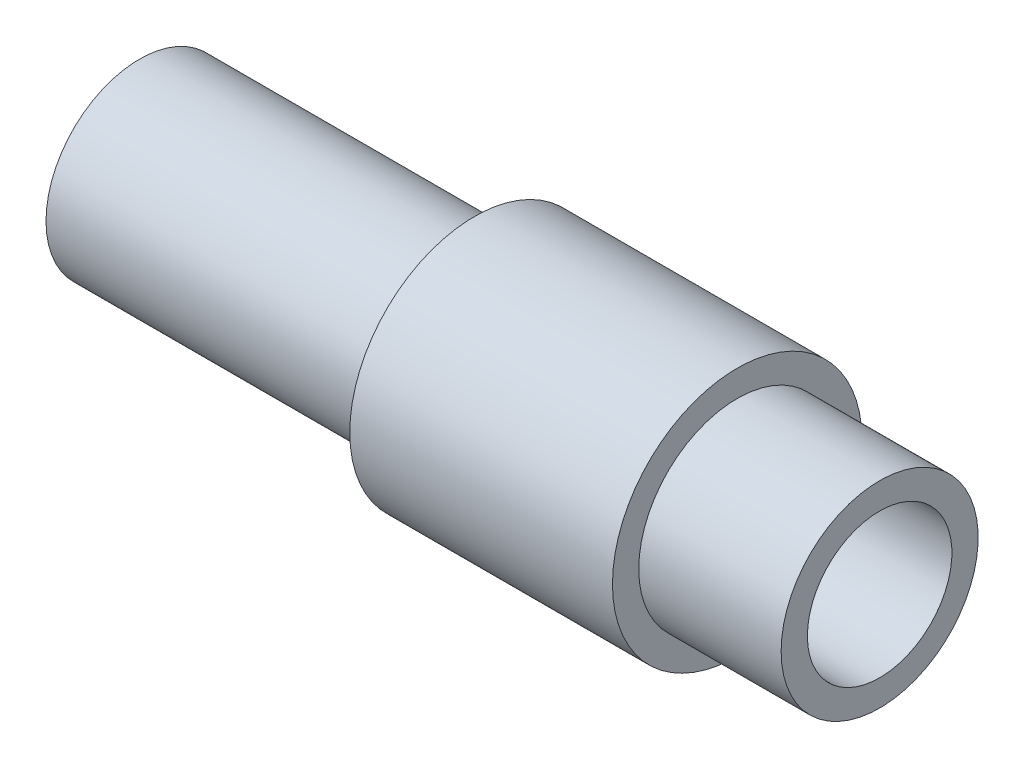
ISO-10303-21;
HEADER;
FILE_DESCRIPTION(('STEP AP214'),'2;1');
FILE_NAME('part.step','',(''),(''),'','','');
FILE_SCHEMA(('AUTOMOTIVE_DESIGN { 1 0 10303 214 1 1 1 1 }'));
ENDSEC;
DATA;
#1=APPLICATION_CONTEXT('core data for automotive mechanical design processes');
#2=APPLICATION_PROTOCOL_DEFINITION('international standard','automotive_design',2000,#1);
#3=PRODUCT_CONTEXT('',#1,'mechanical');
#4=PRODUCT('Part','Part','',(#3));
#5=PRODUCT_RELATED_PRODUCT_CATEGORY('part','',(#4));
#6=PRODUCT_DEFINITION_FORMATION('','',#4);
#7=PRODUCT_DEFINITION_CONTEXT('part definition',#1,'design');
#8=PRODUCT_DEFINITION('design','',#6,#7);
#9=PRODUCT_DEFINITION_SHAPE('','',#8);
#10=(LENGTH_UNIT() NAMED_UNIT(*) SI_UNIT(.MILLI.,.METRE.));
#11=(NAMED_UNIT(*) PLANE_ANGLE_UNIT() SI_UNIT($,.RADIAN.));
#12=(NAMED_UNIT(*) SI_UNIT($,.STERADIAN.) SOLID_ANGLE_UNIT());
#13=UNCERTAINTY_MEASURE_WITH_UNIT(LENGTH_MEASURE(1.E-05),#10,'distance_accuracy_value','');
#14=(GEOMETRIC_REPRESENTATION_CONTEXT(3) GLOBAL_UNCERTAINTY_ASSIGNED_CONTEXT((#13)) GLOBAL_UNIT_ASSIGNED_CONTEXT((#10,
#11,#12)) REPRESENTATION_CONTEXT('',''));
#15=CARTESIAN_POINT('',(0.,0.,0.));
#16=DIRECTION('',(0.,0.,1.));
#17=DIRECTION('',(1.,0.,0.));
#18=AXIS2_PLACEMENT_3D('',#15,#16,#17);
#19=CARTESIAN_POINT('',(-72.1427322201696,26.757857647235,0.));
#20=DIRECTION('',(1.,0.,0.));
#21=DIRECTION('',(0.,0.,-1.));
#22=AXIS2_PLACEMENT_3D('',#19,#20,#21);
#23=PLANE('',#22);
#24=CARTESIAN_POINT('',(-72.1427322201696,19.632857647235,0.));
#25=DIRECTION('',(-1.,0.,0.));
#26=DIRECTION('',(0.,0.,1.));
#27=AXIS2_PLACEMENT_3D('',#24,#25,#26);
#28=CIRCLE('',#27,5.125);
#29=CARTESIAN_POINT('',(-72.1427322201696,19.632857647235,5.125));
#30=VERTEX_POINT('',#29);
#31=EDGE_CURVE('E10',#30,#30,#28,.T.);
#32=ORIENTED_EDGE('',*,*,#31,.F.);
#33=EDGE_LOOP('',(#32));
#34=FACE_BOUND('',#33,.T.);
#35=CARTESIAN_POINT('',(-72.1427322201696,19.632857647235,0.));
#36=DIRECTION('',(-1.,0.,0.));
#37=DIRECTION('',(0.,0.,1.));
#38=AXIS2_PLACEMENT_3D('',#35,#36,#37);
#39=CIRCLE('',#38,7.125);
#40=CARTESIAN_POINT('',(-72.1427322201696,19.632857647235,7.125));
#41=VERTEX_POINT('',#40);
#42=EDGE_CURVE('E75',#41,#41,#39,.T.);
#43=ORIENTED_EDGE('',*,*,#42,.T.);
#44=EDGE_LOOP('',(#43));
#45=FACE_BOUND('',#44,.T.);
#46=ADVANCED_FACE('F35',(#34,#45),#23,.F.);
#47=CARTESIAN_POINT('',(-83.6737426979836,19.632857647235,0.));
#48=DIRECTION('',(-1.,0.,0.));
#49=DIRECTION('',(0.,0.,1.));
#50=AXIS2_PLACEMENT_3D('',#47,#48,#49);
#51=CYLINDRICAL_SURFACE('',#50,5.125);
#52=CARTESIAN_POINT('',(-44.6427322201696,19.632857647235,0.));
#53=DIRECTION('',(-1.,0.,0.));
#54=DIRECTION('',(0.,0.,1.));
#55=AXIS2_PLACEMENT_3D('',#52,#53,#54);
#56=CIRCLE('',#55,5.125);
#57=CARTESIAN_POINT('',(-44.6427322201696,19.632857647235,5.125));
#58=VERTEX_POINT('',#57);
#59=EDGE_CURVE('E41',#58,#58,#56,.T.);
#60=ORIENTED_EDGE('',*,*,#59,.F.);
#61=EDGE_LOOP('',(#60));
#62=FACE_BOUND('',#61,.T.);
#63=ORIENTED_EDGE('',*,*,#31,.T.);
#64=EDGE_LOOP('',(#63));
#65=FACE_BOUND('',#64,.T.);
#66=ADVANCED_FACE('F136',(#62,#65),#51,.F.);
#67=CARTESIAN_POINT('',(-44.6427322201696,24.757857647235,0.));
#68=DIRECTION('',(-1.,0.,0.));
#69=DIRECTION('',(0.,0.,1.));
#70=AXIS2_PLACEMENT_3D('',#67,#68,#69);
#71=PLANE('',#70);
#72=CARTESIAN_POINT('',(-44.6427322201696,19.632857647235,0.));
#73=DIRECTION('',(-1.,0.,0.));
#74=DIRECTION('',(0.,0.,1.));
#75=AXIS2_PLACEMENT_3D('',#72,#73,#74);
#76=CIRCLE('',#75,7.5);
#77=CARTESIAN_POINT('',(-44.6427322201696,19.632857647235,7.5));
#78=VERTEX_POINT('',#77);
#79=EDGE_CURVE('E45',#78,#78,#76,.T.);
#80=ORIENTED_EDGE('',*,*,#79,.F.);
#81=EDGE_LOOP('',(#80));
#82=FACE_BOUND('',#81,.T.);
#83=ORIENTED_EDGE('',*,*,#59,.T.);
#84=EDGE_LOOP('',(#83));
#85=FACE_BOUND('',#84,.T.);
#86=ADVANCED_FACE('F131',(#82,#85),#71,.F.);
#87=CARTESIAN_POINT('',(-83.6737426979836,19.632857647235,0.));
#88=DIRECTION('',(-1.,0.,0.));
#89=DIRECTION('',(0.,0.,1.));
#90=AXIS2_PLACEMENT_3D('',#87,#88,#89);
#91=CYLINDRICAL_SURFACE('',#90,7.5);
#92=CARTESIAN_POINT('',(-28.6427322201696,19.632857647235,0.));
#93=DIRECTION('',(-1.,0.,0.));
#94=DIRECTION('',(0.,0.,1.));
#95=AXIS2_PLACEMENT_3D('',#92,#93,#94);
#96=CIRCLE('',#95,7.5);
#97=CARTESIAN_POINT('',(-28.6427322201696,19.632857647235,7.5));
#98=VERTEX_POINT('',#97);
#99=EDGE_CURVE('E49',#98,#98,#96,.T.);
#100=ORIENTED_EDGE('',*,*,#99,.F.);
#101=EDGE_LOOP('',(#100));
#102=FACE_BOUND('',#101,.T.);
#103=ORIENTED_EDGE('',*,*,#79,.T.);
#104=EDGE_LOOP('',(#103));
#105=FACE_BOUND('',#104,.T.);
#106=ADVANCED_FACE('F125',(#102,#105),#91,.F.);
#107=CARTESIAN_POINT('',(-28.6427322201696,27.132857647235,0.));
#108=DIRECTION('',(1.,0.,0.));
#109=DIRECTION('',(0.,0.,-1.));
#110=AXIS2_PLACEMENT_3D('',#107,#108,#109);
#111=PLANE('',#110);
#112=CARTESIAN_POINT('',(-28.6427322201696,19.632857647235,0.));
#113=DIRECTION('',(-1.,0.,0.));
#114=DIRECTION('',(0.,0.,1.));
#115=AXIS2_PLACEMENT_3D('',#112,#113,#114);
#116=CIRCLE('',#115,5.5);
#117=CARTESIAN_POINT('',(-28.6427322201696,19.632857647235,5.5));
#118=VERTEX_POINT('',#117);
#119=EDGE_CURVE('E54',#118,#118,#116,.T.);
#120=ORIENTED_EDGE('',*,*,#119,.F.);
#121=EDGE_LOOP('',(#120));
#122=FACE_BOUND('',#121,.T.);
#123=ORIENTED_EDGE('',*,*,#99,.T.);
#124=EDGE_LOOP('',(#123));
#125=FACE_BOUND('',#124,.T.);
#126=ADVANCED_FACE('F119',(#122,#125),#111,.F.);
#127=CARTESIAN_POINT('',(-83.6737426979836,19.632857647235,0.));
#128=DIRECTION('',(-1.,0.,0.));
#129=DIRECTION('',(0.,0.,1.));
#130=AXIS2_PLACEMENT_3D('',#127,#128,#129);
#131=CYLINDRICAL_SURFACE('',#130,5.5);
#132=CARTESIAN_POINT('',(-15.8034961508885,19.632857647235,0.));
#133=DIRECTION('',(-1.,0.,0.));
#134=DIRECTION('',(0.,0.,1.));
#135=AXIS2_PLACEMENT_3D('',#132,#133,#134);
#136=CIRCLE('',#135,5.5);
#137=CARTESIAN_POINT('',(-15.8034961508885,19.632857647235,5.5));
#138=VERTEX_POINT('',#137);
#139=EDGE_CURVE('E57',#138,#138,#136,.T.);
#140=ORIENTED_EDGE('',*,*,#139,.F.);
#141=EDGE_LOOP('',(#140));
#142=FACE_BOUND('',#141,.T.);
#143=ORIENTED_EDGE('',*,*,#119,.T.);
#144=EDGE_LOOP('',(#143));
#145=FACE_BOUND('',#144,.T.);
#146=ADVANCED_FACE('F113',(#142,#145),#131,.F.);
#147=CARTESIAN_POINT('',(-15.8034961508885,27.132857647235,0.));
#148=DIRECTION('',(-1.,0.,0.));
#149=DIRECTION('',(0.,0.,1.));
#150=AXIS2_PLACEMENT_3D('',#147,#148,#149);
#151=PLANE('',#150);
#152=CARTESIAN_POINT('',(-15.8034961508885,19.632857647235,0.));
#153=DIRECTION('',(-1.,0.,0.));
#154=DIRECTION('',(0.,0.,1.));
#155=AXIS2_PLACEMENT_3D('',#152,#153,#154);
#156=CIRCLE('',#155,7.5);
#157=CARTESIAN_POINT('',(-15.8034961508885,19.632857647235,7.5));
#158=VERTEX_POINT('',#157);
#159=EDGE_CURVE('E60',#158,#158,#156,.T.);
#160=ORIENTED_EDGE('',*,*,#159,.F.);
#161=EDGE_LOOP('',(#160));
#162=FACE_BOUND('',#161,.T.);
#163=ORIENTED_EDGE('',*,*,#139,.T.);
#164=EDGE_LOOP('',(#163));
#165=FACE_BOUND('',#164,.T.);
#166=ADVANCED_FACE('F107',(#162,#165),#151,.F.);
#167=CARTESIAN_POINT('',(-83.6737426979836,19.632857647235,0.));
#168=DIRECTION('',(-1.,0.,0.));
#169=DIRECTION('',(0.,0.,1.));
#170=AXIS2_PLACEMENT_3D('',#167,#168,#169);
#171=CYLINDRICAL_SURFACE('',#170,7.5);
#172=CARTESIAN_POINT('',(-26.6427322201696,19.632857647235,0.));
#173=DIRECTION('',(-1.,0.,0.));
#174=DIRECTION('',(0.,0.,1.));
#175=AXIS2_PLACEMENT_3D('',#172,#173,#174);
#176=CIRCLE('',#175,7.5);
#177=CARTESIAN_POINT('',(-26.6427322201696,19.632857647235,7.5));
#178=VERTEX_POINT('',#177);
#179=EDGE_CURVE('E63',#178,#178,#176,.T.);
#180=ORIENTED_EDGE('',*,*,#179,.F.);
#181=EDGE_LOOP('',(#180));
#182=FACE_BOUND('',#181,.T.);
#183=ORIENTED_EDGE('',*,*,#159,.T.);
#184=EDGE_LOOP('',(#183));
#185=FACE_BOUND('',#184,.T.);
#186=ADVANCED_FACE('F101',(#182,#185),#171,.T.);
#187=CARTESIAN_POINT('',(-26.6427322201696,29.132857647235,0.));
#188=DIRECTION('',(-1.,0.,0.));
#189=DIRECTION('',(0.,0.,1.));
#190=AXIS2_PLACEMENT_3D('',#187,#188,#189);
#191=PLANE('',#190);
#192=CARTESIAN_POINT('',(-26.6427322201696,19.632857647235,0.));
#193=DIRECTION('',(-1.,0.,0.));
#194=DIRECTION('',(0.,0.,1.));
#195=AXIS2_PLACEMENT_3D('',#192,#193,#194);
#196=CIRCLE('',#195,9.5);
#197=CARTESIAN_POINT('',(-26.6427322201696,19.632857647235,9.5));
#198=VERTEX_POINT('',#197);
#199=EDGE_CURVE('E66',#198,#198,#196,.T.);
#200=ORIENTED_EDGE('',*,*,#199,.F.);
#201=EDGE_LOOP('',(#200));
#202=FACE_BOUND('',#201,.T.);
#203=ORIENTED_EDGE('',*,*,#179,.T.);
#204=EDGE_LOOP('',(#203));
#205=FACE_BOUND('',#204,.T.);
#206=ADVANCED_FACE('F95',(#202,#205),#191,.F.);
#207=CARTESIAN_POINT('',(-83.6737426979836,19.632857647235,0.));
#208=DIRECTION('',(-1.,0.,0.));
#209=DIRECTION('',(0.,0.,1.));
#210=AXIS2_PLACEMENT_3D('',#207,#208,#209);
#211=CYLINDRICAL_SURFACE('',#210,9.5);
#212=CARTESIAN_POINT('',(-46.6427322201696,19.632857647235,0.));
#213=DIRECTION('',(-1.,0.,0.));
#214=DIRECTION('',(0.,0.,1.));
#215=AXIS2_PLACEMENT_3D('',#212,#213,#214);
#216=CIRCLE('',#215,9.5);
#217=CARTESIAN_POINT('',(-46.6427322201696,19.632857647235,9.5));
#218=VERTEX_POINT('',#217);
#219=EDGE_CURVE('E69',#218,#218,#216,.T.);
#220=ORIENTED_EDGE('',*,*,#219,.F.);
#221=EDGE_LOOP('',(#220));
#222=FACE_BOUND('',#221,.T.);
#223=ORIENTED_EDGE('',*,*,#199,.T.);
#224=EDGE_LOOP('',(#223));
#225=FACE_BOUND('',#224,.T.);
#226=ADVANCED_FACE('F89',(#222,#225),#211,.T.);
#227=CARTESIAN_POINT('',(-46.6427322201696,26.757857647235,0.));
#228=DIRECTION('',(1.,0.,0.));
#229=DIRECTION('',(0.,0.,-1.));
#230=AXIS2_PLACEMENT_3D('',#227,#228,#229);
#231=PLANE('',#230);
#232=CARTESIAN_POINT('',(-46.6427322201696,19.632857647235,0.));
#233=DIRECTION('',(-1.,0.,0.));
#234=DIRECTION('',(0.,0.,1.));
#235=AXIS2_PLACEMENT_3D('',#232,#233,#234);
#236=CIRCLE('',#235,7.125);
#237=CARTESIAN_POINT('',(-46.6427322201696,19.632857647235,7.125));
#238=VERTEX_POINT('',#237);
#239=EDGE_CURVE('E72',#238,#238,#236,.T.);
#240=ORIENTED_EDGE('',*,*,#239,.F.);
#241=EDGE_LOOP('',(#240));
#242=FACE_BOUND('',#241,.T.);
#243=ORIENTED_EDGE('',*,*,#219,.T.);
#244=EDGE_LOOP('',(#243));
#245=FACE_BOUND('',#244,.T.);
#246=ADVANCED_FACE('F83',(#242,#245),#231,.F.);
#247=CARTESIAN_POINT('',(-83.6737426979836,19.632857647235,0.));
#248=DIRECTION('',(-1.,0.,0.));
#249=DIRECTION('',(0.,0.,1.));
#250=AXIS2_PLACEMENT_3D('',#247,#248,#249);
#251=CYLINDRICAL_SURFACE('',#250,7.125);
#252=ORIENTED_EDGE('',*,*,#42,.F.);
#253=EDGE_LOOP('',(#252));
#254=FACE_BOUND('',#253,.T.);
#255=ORIENTED_EDGE('',*,*,#239,.T.);
#256=EDGE_LOOP('',(#255));
#257=FACE_BOUND('',#256,.T.);
#258=ADVANCED_FACE('F80',(#254,#257),#251,.T.);
#259=CLOSED_SHELL('',(#46,#66,#86,#106,#126,#146,#166,#186,#206,#226,#246,#258));
#260=MANIFOLD_SOLID_BREP('B2',#259);
#261=ADVANCED_BREP_SHAPE_REPRESENTATION('',(#18,#260),#14);
#262=SHAPE_DEFINITION_REPRESENTATION(#9,#261);
ENDSEC;
END-ISO-10303-21;
